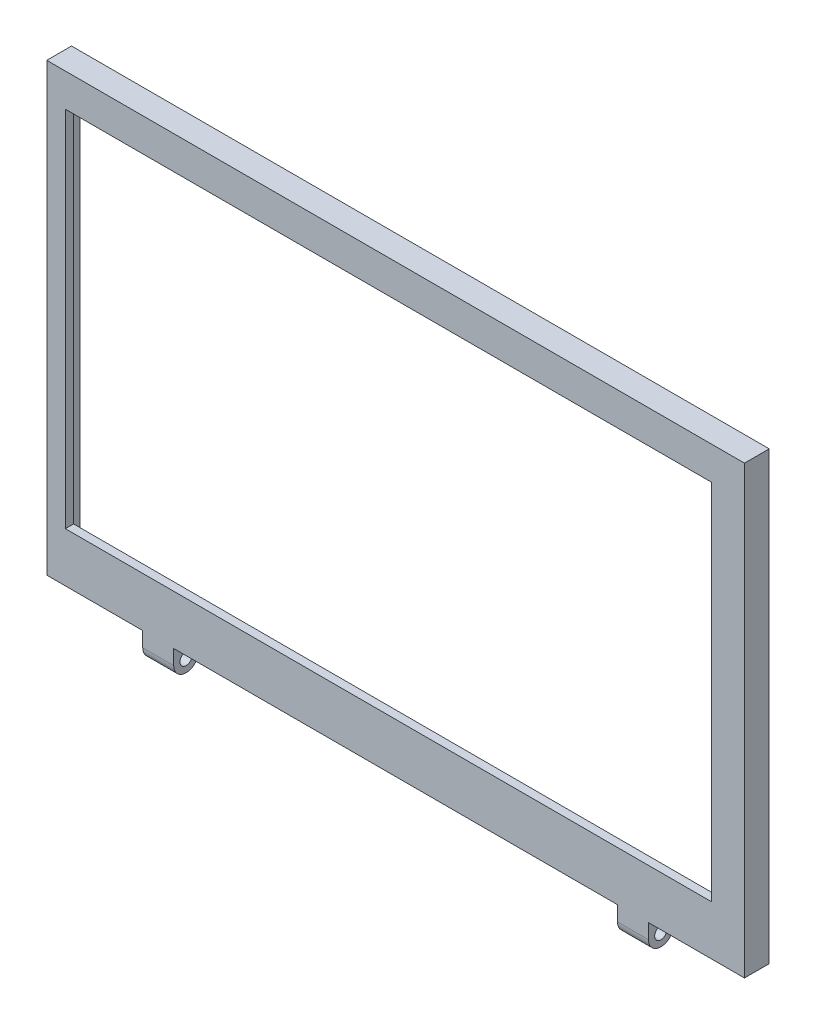
ISO-10303-21;
HEADER;
FILE_DESCRIPTION(('STEP AP214'),'2;1');
FILE_NAME('part.step','',(''),(''),'','','');
FILE_SCHEMA(('AUTOMOTIVE_DESIGN { 1 0 10303 214 1 1 1 1 }'));
ENDSEC;
DATA;
#1=APPLICATION_CONTEXT('core data for automotive mechanical design processes');
#2=APPLICATION_PROTOCOL_DEFINITION('international standard','automotive_design',2000,#1);
#3=PRODUCT_CONTEXT('',#1,'mechanical');
#4=PRODUCT('Part','Part','',(#3));
#5=PRODUCT_RELATED_PRODUCT_CATEGORY('part','',(#4));
#6=PRODUCT_DEFINITION_FORMATION('','',#4);
#7=PRODUCT_DEFINITION_CONTEXT('part definition',#1,'design');
#8=PRODUCT_DEFINITION('design','',#6,#7);
#9=PRODUCT_DEFINITION_SHAPE('','',#8);
#10=(LENGTH_UNIT() NAMED_UNIT(*) SI_UNIT(.MILLI.,.METRE.));
#11=(NAMED_UNIT(*) PLANE_ANGLE_UNIT() SI_UNIT($,.RADIAN.));
#12=(NAMED_UNIT(*) SI_UNIT($,.STERADIAN.) SOLID_ANGLE_UNIT());
#13=UNCERTAINTY_MEASURE_WITH_UNIT(LENGTH_MEASURE(1.E-05),#10,'distance_accuracy_value','');
#14=(GEOMETRIC_REPRESENTATION_CONTEXT(3) GLOBAL_UNCERTAINTY_ASSIGNED_CONTEXT((#13)) GLOBAL_UNIT_ASSIGNED_CONTEXT((#10,
#11,#12)) REPRESENTATION_CONTEXT('',''));
#15=CARTESIAN_POINT('',(0.,0.,0.));
#16=DIRECTION('',(0.,0.,1.));
#17=DIRECTION('',(1.,0.,0.));
#18=AXIS2_PLACEMENT_3D('',#15,#16,#17);
#19=CARTESIAN_POINT('',(53.75,29.,32.));
#20=DIRECTION('',(1.,0.,0.));
#21=DIRECTION('',(0.,0.,1.));
#22=AXIS2_PLACEMENT_3D('',#19,#20,#21);
#23=PLANE('',#22);
#24=DIRECTION('',(0.,-1.,0.));
#25=VECTOR('',#24,1.);
#26=CARTESIAN_POINT('',(53.75,29.,29.));
#27=LINE('',#26,#25);
#28=CARTESIAN_POINT('',(53.75,32.6036869439865,29.));
#29=VERTEX_POINT('',#28);
#30=CARTESIAN_POINT('',(53.75,29.,29.));
#31=VERTEX_POINT('',#30);
#32=EDGE_CURVE('E1127',#29,#31,#27,.T.);
#33=ORIENTED_EDGE('',*,*,#32,.T.);
#34=CARTESIAN_POINT('',(53.75,29.,32.));
#35=DIRECTION('',(-1.,0.,0.));
#36=DIRECTION('',(0.,0.,1.));
#37=AXIS2_PLACEMENT_3D('',#34,#35,#36);
#38=CIRCLE('',#37,3.);
#39=CARTESIAN_POINT('',(53.75,29.,35.));
#40=VERTEX_POINT('',#39);
#41=EDGE_CURVE('E945',#31,#40,#38,.T.);
#42=ORIENTED_EDGE('',*,*,#41,.T.);
#43=DIRECTION('',(0.,1.,0.));
#44=VECTOR('',#43,1.);
#45=CARTESIAN_POINT('',(53.75,29.,35.));
#46=LINE('',#45,#44);
#47=CARTESIAN_POINT('',(53.75,32.6036869439865,35.));
#48=VERTEX_POINT('',#47);
#49=EDGE_CURVE('E1102',#40,#48,#46,.T.);
#50=ORIENTED_EDGE('',*,*,#49,.T.);
#51=DIRECTION('',(0.,0.,-1.));
#52=VECTOR('',#51,1.);
#53=CARTESIAN_POINT('',(53.75,32.6036869439865,29.));
#54=LINE('',#53,#52);
#55=EDGE_CURVE('E1115',#48,#29,#54,.T.);
#56=ORIENTED_EDGE('',*,*,#55,.T.);
#57=EDGE_LOOP('',(#33,#42,#50,#56));
#58=FACE_BOUND('',#57,.T.);
#59=CARTESIAN_POINT('',(53.75,29.,32.));
#60=DIRECTION('',(-1.,0.,0.));
#61=DIRECTION('',(0.,0.,1.));
#62=AXIS2_PLACEMENT_3D('',#59,#60,#61);
#63=CIRCLE('',#62,1.5);
#64=CARTESIAN_POINT('',(53.75,29.,33.5));
#65=VERTEX_POINT('',#64);
#66=EDGE_CURVE('E1151',#65,#65,#63,.T.);
#67=ORIENTED_EDGE('',*,*,#66,.F.);
#68=EDGE_LOOP('',(#67));
#69=FACE_BOUND('',#68,.T.);
#70=ADVANCED_FACE('F941',(#58,#69),#23,.F.);
#71=CARTESIAN_POINT('',(-53.75,29.,32.));
#72=DIRECTION('',(-1.,0.,0.));
#73=DIRECTION('',(0.,0.,1.));
#74=AXIS2_PLACEMENT_3D('',#71,#72,#73);
#75=PLANE('',#74);
#76=DIRECTION('',(0.,-1.,0.));
#77=VECTOR('',#76,1.);
#78=CARTESIAN_POINT('',(-53.75,29.,29.));
#79=LINE('',#78,#77);
#80=CARTESIAN_POINT('',(-53.75,32.6036869439865,29.));
#81=VERTEX_POINT('',#80);
#82=CARTESIAN_POINT('',(-53.75,29.,29.));
#83=VERTEX_POINT('',#82);
#84=EDGE_CURVE('E1140',#81,#83,#79,.T.);
#85=ORIENTED_EDGE('',*,*,#84,.F.);
#86=DIRECTION('',(0.,0.,-1.));
#87=VECTOR('',#86,1.);
#88=CARTESIAN_POINT('',(-53.75,32.6036869439865,29.));
#89=LINE('',#88,#87);
#90=CARTESIAN_POINT('',(-53.75,32.6036869439865,35.));
#91=VERTEX_POINT('',#90);
#92=EDGE_CURVE('E1241',#91,#81,#89,.T.);
#93=ORIENTED_EDGE('',*,*,#92,.F.);
#94=DIRECTION('',(0.,1.,0.));
#95=VECTOR('',#94,1.);
#96=CARTESIAN_POINT('',(-53.75,29.,35.));
#97=LINE('',#96,#95);
#98=CARTESIAN_POINT('',(-53.75,29.,35.));
#99=VERTEX_POINT('',#98);
#100=EDGE_CURVE('E1240',#99,#91,#97,.T.);
#101=ORIENTED_EDGE('',*,*,#100,.F.);
#102=CARTESIAN_POINT('',(-53.75,29.,32.));
#103=DIRECTION('',(-1.,0.,0.));
#104=DIRECTION('',(0.,0.,1.));
#105=AXIS2_PLACEMENT_3D('',#102,#103,#104);
#106=CIRCLE('',#105,3.);
#107=EDGE_CURVE('E1237',#83,#99,#106,.T.);
#108=ORIENTED_EDGE('',*,*,#107,.F.);
#109=EDGE_LOOP('',(#85,#93,#101,#108));
#110=FACE_BOUND('',#109,.T.);
#111=CARTESIAN_POINT('',(-53.75,29.,32.));
#112=DIRECTION('',(-1.,0.,0.));
#113=DIRECTION('',(0.,0.,1.));
#114=AXIS2_PLACEMENT_3D('',#111,#112,#113);
#115=CIRCLE('',#114,1.5);
#116=CARTESIAN_POINT('',(-53.75,29.,33.5));
#117=VERTEX_POINT('',#116);
#118=EDGE_CURVE('E1129',#117,#117,#115,.T.);
#119=ORIENTED_EDGE('',*,*,#118,.T.);
#120=EDGE_LOOP('',(#119));
#121=FACE_BOUND('',#120,.T.);
#122=ADVANCED_FACE('F943',(#110,#121),#75,.F.);
#123=CARTESIAN_POINT('',(0.,0.,33.));
#124=DIRECTION('',(0.,0.,1.));
#125=DIRECTION('',(1.,0.,0.));
#126=AXIS2_PLACEMENT_3D('',#123,#124,#125);
#127=PLANE('',#126);
#128=DIRECTION('',(1.,0.,0.));
#129=VECTOR('',#128,1.);
#130=CARTESIAN_POINT('',(0.,34.6036869439865,33.));
#131=LINE('',#130,#129);
#132=CARTESIAN_POINT('',(-82.5,34.6036869439865,33.));
#133=VERTEX_POINT('',#132);
#134=CARTESIAN_POINT('',(-21.,34.6036869439865,33.));
#135=VERTEX_POINT('',#134);
#136=EDGE_CURVE('E1172',#133,#135,#131,.T.);
#137=ORIENTED_EDGE('',*,*,#136,.F.);
#138=DIRECTION('',(0.,-1.,0.));
#139=VECTOR('',#138,1.);
#140=CARTESIAN_POINT('',(-82.5,36.6036869439865,33.));
#141=LINE('',#140,#139);
#142=CARTESIAN_POINT('',(-82.5,138.603686943987,33.));
#143=VERTEX_POINT('',#142);
#144=EDGE_CURVE('E1335',#143,#133,#141,.T.);
#145=ORIENTED_EDGE('',*,*,#144,.F.);
#146=DIRECTION('',(-1.,0.,0.));
#147=VECTOR('',#146,1.);
#148=CARTESIAN_POINT('',(-82.5,138.603686943987,33.));
#149=LINE('',#148,#147);
#150=CARTESIAN_POINT('',(82.5,138.603686943987,33.));
#151=VERTEX_POINT('',#150);
#152=EDGE_CURVE('E1189',#151,#143,#149,.T.);
#153=ORIENTED_EDGE('',*,*,#152,.F.);
#154=DIRECTION('',(0.,1.,0.));
#155=VECTOR('',#154,1.);
#156=CARTESIAN_POINT('',(82.5,36.6036869439865,33.));
#157=LINE('',#156,#155);
#158=CARTESIAN_POINT('',(82.5,34.6036869439865,33.));
#159=VERTEX_POINT('',#158);
#160=EDGE_CURVE('E1186',#159,#151,#157,.T.);
#161=ORIENTED_EDGE('',*,*,#160,.F.);
#162=CARTESIAN_POINT('',(21.,34.6036869439865,33.));
#163=VERTEX_POINT('',#162);
#164=EDGE_CURVE('E1185',#163,#159,#131,.T.);
#165=ORIENTED_EDGE('',*,*,#164,.F.);
#166=DIRECTION('',(0.,1.,0.));
#167=VECTOR('',#166,1.);
#168=CARTESIAN_POINT('',(21.,29.6036869439865,33.));
#169=LINE('',#168,#167);
#170=CARTESIAN_POINT('',(21.,32.6036869439865,33.));
#171=VERTEX_POINT('',#170);
#172=EDGE_CURVE('E965',#171,#163,#169,.T.);
#173=ORIENTED_EDGE('',*,*,#172,.F.);
#174=DIRECTION('',(1.,0.,0.));
#175=VECTOR('',#174,1.);
#176=CARTESIAN_POINT('',(0.,32.6036869439865,33.));
#177=LINE('',#176,#175);
#178=CARTESIAN_POINT('',(-21.,32.6036869439865,33.));
#179=VERTEX_POINT('',#178);
#180=EDGE_CURVE('E1131',#179,#171,#177,.T.);
#181=ORIENTED_EDGE('',*,*,#180,.F.);
#182=DIRECTION('',(0.,1.,0.));
#183=VECTOR('',#182,1.);
#184=CARTESIAN_POINT('',(-21.,29.6036869439865,33.));
#185=LINE('',#184,#183);
#186=EDGE_CURVE('E1230',#179,#135,#185,.T.);
#187=ORIENTED_EDGE('',*,*,#186,.T.);
#188=EDGE_LOOP('',(#137,#145,#153,#161,#165,#173,#181,#187));
#189=FACE_BOUND('',#188,.T.);
#190=DIRECTION('',(0.,-1.,0.));
#191=VECTOR('',#190,1.);
#192=CARTESIAN_POINT('',(-80.,44.6036869439865,33.));
#193=LINE('',#192,#191);
#194=CARTESIAN_POINT('',(-80.,132.603686943987,33.));
#195=VERTEX_POINT('',#194);
#196=CARTESIAN_POINT('',(-80.,44.6036869439865,33.));
#197=VERTEX_POINT('',#196);
#198=EDGE_CURVE('E1196',#195,#197,#193,.T.);
#199=ORIENTED_EDGE('',*,*,#198,.T.);
#200=DIRECTION('',(1.,0.,0.));
#201=VECTOR('',#200,1.);
#202=CARTESIAN_POINT('',(76.5,44.6036869439865,33.));
#203=LINE('',#202,#201);
#204=CARTESIAN_POINT('',(76.5,44.6036869439865,33.));
#205=VERTEX_POINT('',#204);
#206=EDGE_CURVE('E1206',#197,#205,#203,.T.);
#207=ORIENTED_EDGE('',*,*,#206,.T.);
#208=DIRECTION('',(0.,1.,0.));
#209=VECTOR('',#208,1.);
#210=CARTESIAN_POINT('',(76.5,132.603686943987,33.));
#211=LINE('',#210,#209);
#212=CARTESIAN_POINT('',(76.5,132.603686943987,33.));
#213=VERTEX_POINT('',#212);
#214=EDGE_CURVE('E1220',#205,#213,#211,.T.);
#215=ORIENTED_EDGE('',*,*,#214,.T.);
#216=DIRECTION('',(-1.,0.,0.));
#217=VECTOR('',#216,1.);
#218=CARTESIAN_POINT('',(-80.,132.603686943987,33.));
#219=LINE('',#218,#217);
#220=EDGE_CURVE('E1217',#213,#195,#219,.T.);
#221=ORIENTED_EDGE('',*,*,#220,.T.);
#222=EDGE_LOOP('',(#199,#207,#215,#221));
#223=FACE_BOUND('',#222,.T.);
#224=ADVANCED_FACE('F1366',(#189,#223),#127,.F.);
#225=CARTESIAN_POINT('',(76.5,132.603686943987,33.));
#226=DIRECTION('',(1.,0.,0.));
#227=DIRECTION('',(0.,1.,0.));
#228=AXIS2_PLACEMENT_3D('',#225,#226,#227);
#229=PLANE('',#228);
#230=DIRECTION('',(0.,1.,0.));
#231=VECTOR('',#230,1.);
#232=CARTESIAN_POINT('',(76.5,132.603686943987,35.));
#233=LINE('',#232,#231);
#234=CARTESIAN_POINT('',(76.5,44.6036869439865,35.));
#235=VERTEX_POINT('',#234);
#236=CARTESIAN_POINT('',(76.5,132.603686943987,35.));
#237=VERTEX_POINT('',#236);
#238=EDGE_CURVE('E1209',#235,#237,#233,.T.);
#239=ORIENTED_EDGE('',*,*,#238,.T.);
#240=DIRECTION('',(0.,0.,1.));
#241=VECTOR('',#240,1.);
#242=CARTESIAN_POINT('',(76.5,132.603686943987,33.));
#243=LINE('',#242,#241);
#244=EDGE_CURVE('E1197',#213,#237,#243,.T.);
#245=ORIENTED_EDGE('',*,*,#244,.F.);
#246=ORIENTED_EDGE('',*,*,#214,.F.);
#247=DIRECTION('',(0.,0.,1.));
#248=VECTOR('',#247,1.);
#249=CARTESIAN_POINT('',(76.5,44.6036869439865,33.));
#250=LINE('',#249,#248);
#251=EDGE_CURVE('E1193',#205,#235,#250,.T.);
#252=ORIENTED_EDGE('',*,*,#251,.T.);
#253=EDGE_LOOP('',(#239,#245,#246,#252));
#254=FACE_BOUND('',#253,.T.);
#255=ADVANCED_FACE('F1380',(#254),#229,.F.);
#256=CARTESIAN_POINT('',(-80.,132.603686943987,33.));
#257=DIRECTION('',(0.,1.,0.));
#258=DIRECTION('',(0.,0.,1.));
#259=AXIS2_PLACEMENT_3D('',#256,#257,#258);
#260=PLANE('',#259);
#261=DIRECTION('',(-1.,0.,0.));
#262=VECTOR('',#261,1.);
#263=CARTESIAN_POINT('',(-80.,132.603686943987,35.));
#264=LINE('',#263,#262);
#265=CARTESIAN_POINT('',(-80.,132.603686943987,35.));
#266=VERTEX_POINT('',#265);
#267=EDGE_CURVE('E1205',#237,#266,#264,.T.);
#268=ORIENTED_EDGE('',*,*,#267,.T.);
#269=DIRECTION('',(0.,0.,1.));
#270=VECTOR('',#269,1.);
#271=CARTESIAN_POINT('',(-80.,132.603686943987,33.));
#272=LINE('',#271,#270);
#273=EDGE_CURVE('E1199',#195,#266,#272,.T.);
#274=ORIENTED_EDGE('',*,*,#273,.F.);
#275=ORIENTED_EDGE('',*,*,#220,.F.);
#276=ORIENTED_EDGE('',*,*,#244,.T.);
#277=EDGE_LOOP('',(#268,#274,#275,#276));
#278=FACE_BOUND('',#277,.T.);
#279=ADVANCED_FACE('F1386',(#278),#260,.F.);
#280=CARTESIAN_POINT('',(-80.,44.6036869439865,33.));
#281=DIRECTION('',(-1.,0.,0.));
#282=DIRECTION('',(0.,-1.,0.));
#283=AXIS2_PLACEMENT_3D('',#280,#281,#282);
#284=PLANE('',#283);
#285=DIRECTION('',(0.,-1.,0.));
#286=VECTOR('',#285,1.);
#287=CARTESIAN_POINT('',(-80.,44.6036869439865,35.));
#288=LINE('',#287,#286);
#289=CARTESIAN_POINT('',(-80.,44.6036869439865,35.));
#290=VERTEX_POINT('',#289);
#291=EDGE_CURVE('E1202',#266,#290,#288,.T.);
#292=ORIENTED_EDGE('',*,*,#291,.T.);
#293=DIRECTION('',(0.,0.,1.));
#294=VECTOR('',#293,1.);
#295=CARTESIAN_POINT('',(-80.,44.6036869439865,33.));
#296=LINE('',#295,#294);
#297=EDGE_CURVE('E1192',#197,#290,#296,.T.);
#298=ORIENTED_EDGE('',*,*,#297,.F.);
#299=ORIENTED_EDGE('',*,*,#198,.F.);
#300=ORIENTED_EDGE('',*,*,#273,.T.);
#301=EDGE_LOOP('',(#292,#298,#299,#300));
#302=FACE_BOUND('',#301,.T.);
#303=ADVANCED_FACE('F1396',(#302),#284,.F.);
#304=CARTESIAN_POINT('',(76.5,44.6036869439865,33.));
#305=DIRECTION('',(0.,-1.,0.));
#306=DIRECTION('',(1.,0.,0.));
#307=AXIS2_PLACEMENT_3D('',#304,#305,#306);
#308=PLANE('',#307);
#309=DIRECTION('',(1.,0.,0.));
#310=VECTOR('',#309,1.);
#311=CARTESIAN_POINT('',(76.5,44.6036869439865,35.));
#312=LINE('',#311,#310);
#313=EDGE_CURVE('E1212',#290,#235,#312,.T.);
#314=ORIENTED_EDGE('',*,*,#313,.T.);
#315=ORIENTED_EDGE('',*,*,#251,.F.);
#316=ORIENTED_EDGE('',*,*,#206,.F.);
#317=ORIENTED_EDGE('',*,*,#297,.T.);
#318=EDGE_LOOP('',(#314,#315,#316,#317));
#319=FACE_BOUND('',#318,.T.);
#320=ADVANCED_FACE('F1394',(#319),#308,.F.);
#321=CARTESIAN_POINT('',(61.25,29.,32.));
#322=DIRECTION('',(-1.,0.,0.));
#323=DIRECTION('',(0.,0.,-1.));
#324=AXIS2_PLACEMENT_3D('',#321,#322,#323);
#325=CYLINDRICAL_SURFACE('',#324,3.);
#326=ORIENTED_EDGE('',*,*,#41,.F.);
#327=DIRECTION('',(-1.,0.,0.));
#328=VECTOR('',#327,1.);
#329=CARTESIAN_POINT('',(61.25,29.,29.));
#330=LINE('',#329,#328);
#331=CARTESIAN_POINT('',(61.25,29.,29.));
#332=VERTEX_POINT('',#331);
#333=EDGE_CURVE('E1122',#332,#31,#330,.T.);
#334=ORIENTED_EDGE('',*,*,#333,.F.);
#335=CARTESIAN_POINT('',(61.25,29.,32.));
#336=DIRECTION('',(-1.,0.,0.));
#337=DIRECTION('',(0.,0.,1.));
#338=AXIS2_PLACEMENT_3D('',#335,#336,#337);
#339=CIRCLE('',#338,3.);
#340=CARTESIAN_POINT('',(61.25,29.,35.));
#341=VERTEX_POINT('',#340);
#342=EDGE_CURVE('E1121',#332,#341,#339,.T.);
#343=ORIENTED_EDGE('',*,*,#342,.T.);
#344=DIRECTION('',(-1.,0.,0.));
#345=VECTOR('',#344,1.);
#346=CARTESIAN_POINT('',(61.25,29.,35.));
#347=LINE('',#346,#345);
#348=EDGE_CURVE('E1107',#341,#40,#347,.T.);
#349=ORIENTED_EDGE('',*,*,#348,.T.);
#350=EDGE_LOOP('',(#326,#334,#343,#349));
#351=FACE_BOUND('',#350,.T.);
#352=ADVANCED_FACE('F1119',(#351),#325,.T.);
#353=CARTESIAN_POINT('',(61.25,29.,32.));
#354=DIRECTION('',(1.,0.,0.));
#355=DIRECTION('',(0.,0.,1.));
#356=AXIS2_PLACEMENT_3D('',#353,#354,#355);
#357=PLANE('',#356);
#358=ORIENTED_EDGE('',*,*,#342,.F.);
#359=DIRECTION('',(0.,-1.,0.));
#360=VECTOR('',#359,1.);
#361=CARTESIAN_POINT('',(61.25,29.,29.));
#362=LINE('',#361,#360);
#363=CARTESIAN_POINT('',(61.25,32.6036869439865,29.));
#364=VERTEX_POINT('',#363);
#365=EDGE_CURVE('E1293',#364,#332,#362,.T.);
#366=ORIENTED_EDGE('',*,*,#365,.F.);
#367=DIRECTION('',(0.,0.,-1.));
#368=VECTOR('',#367,1.);
#369=CARTESIAN_POINT('',(61.25,32.6036869439865,29.));
#370=LINE('',#369,#368);
#371=CARTESIAN_POINT('',(61.25,32.6036869439865,35.));
#372=VERTEX_POINT('',#371);
#373=EDGE_CURVE('E1145',#372,#364,#370,.T.);
#374=ORIENTED_EDGE('',*,*,#373,.F.);
#375=DIRECTION('',(0.,1.,0.));
#376=VECTOR('',#375,1.);
#377=CARTESIAN_POINT('',(61.25,29.,35.));
#378=LINE('',#377,#376);
#379=EDGE_CURVE('E1143',#341,#372,#378,.T.);
#380=ORIENTED_EDGE('',*,*,#379,.F.);
#381=EDGE_LOOP('',(#358,#366,#374,#380));
#382=FACE_BOUND('',#381,.T.);
#383=CARTESIAN_POINT('',(61.25,29.,32.));
#384=DIRECTION('',(-1.,0.,0.));
#385=DIRECTION('',(0.,0.,1.));
#386=AXIS2_PLACEMENT_3D('',#383,#384,#385);
#387=CIRCLE('',#386,1.5);
#388=CARTESIAN_POINT('',(61.25,29.,33.5));
#389=VERTEX_POINT('',#388);
#390=EDGE_CURVE('E1114',#389,#389,#387,.T.);
#391=ORIENTED_EDGE('',*,*,#390,.T.);
#392=EDGE_LOOP('',(#391));
#393=FACE_BOUND('',#392,.T.);
#394=ADVANCED_FACE('F1304',(#382,#393),#357,.T.);
#395=CARTESIAN_POINT('',(0.,32.6036869439865,0.));
#396=DIRECTION('',(0.,1.,0.));
#397=DIRECTION('',(0.,0.,1.));
#398=AXIS2_PLACEMENT_3D('',#395,#396,#397);
#399=PLANE('',#398);
#400=ORIENTED_EDGE('',*,*,#373,.T.);
#401=DIRECTION('',(-1.,0.,0.));
#402=VECTOR('',#401,1.);
#403=CARTESIAN_POINT('',(-84.5,32.6036869439865,29.));
#404=LINE('',#403,#402);
#405=CARTESIAN_POINT('',(84.5,32.6036869439865,29.));
#406=VERTEX_POINT('',#405);
#407=EDGE_CURVE('E1277',#406,#364,#404,.T.);
#408=ORIENTED_EDGE('',*,*,#407,.F.);
#409=DIRECTION('',(0.,0.,-1.));
#410=VECTOR('',#409,1.);
#411=CARTESIAN_POINT('',(84.5,32.6036869439865,29.));
#412=LINE('',#411,#410);
#413=CARTESIAN_POINT('',(84.5,32.6036869439865,35.));
#414=VERTEX_POINT('',#413);
#415=EDGE_CURVE('E1284',#414,#406,#412,.T.);
#416=ORIENTED_EDGE('',*,*,#415,.F.);
#417=DIRECTION('',(1.,0.,0.));
#418=VECTOR('',#417,1.);
#419=CARTESIAN_POINT('',(-84.5,32.6036869439865,35.));
#420=LINE('',#419,#418);
#421=EDGE_CURVE('E1289',#372,#414,#420,.T.);
#422=ORIENTED_EDGE('',*,*,#421,.F.);
#423=EDGE_LOOP('',(#400,#408,#416,#422));
#424=FACE_BOUND('',#423,.T.);
#425=ADVANCED_FACE('F1301',(#424),#399,.F.);
#426=CARTESIAN_POINT('',(84.5,34.6036869439865,29.));
#427=DIRECTION('',(-1.,0.,0.));
#428=DIRECTION('',(0.,0.,1.));
#429=AXIS2_PLACEMENT_3D('',#426,#427,#428);
#430=PLANE('',#429);
#431=ORIENTED_EDGE('',*,*,#415,.T.);
#432=DIRECTION('',(0.,-1.,0.));
#433=VECTOR('',#432,1.);
#434=CARTESIAN_POINT('',(84.5,34.6036869439865,29.));
#435=LINE('',#434,#433);
#436=CARTESIAN_POINT('',(84.5,140.603686943987,29.));
#437=VERTEX_POINT('',#436);
#438=EDGE_CURVE('E1270',#437,#406,#435,.T.);
#439=ORIENTED_EDGE('',*,*,#438,.F.);
#440=DIRECTION('',(0.,0.,1.));
#441=VECTOR('',#440,1.);
#442=CARTESIAN_POINT('',(84.5,140.603686943987,29.));
#443=LINE('',#442,#441);
#444=CARTESIAN_POINT('',(84.5,140.603686943987,35.));
#445=VERTEX_POINT('',#444);
#446=EDGE_CURVE('E1165',#437,#445,#443,.T.);
#447=ORIENTED_EDGE('',*,*,#446,.T.);
#448=DIRECTION('',(0.,-1.,0.));
#449=VECTOR('',#448,1.);
#450=CARTESIAN_POINT('',(84.5,34.6036869439865,35.));
#451=LINE('',#450,#449);
#452=EDGE_CURVE('E1267',#445,#414,#451,.T.);
#453=ORIENTED_EDGE('',*,*,#452,.T.);
#454=EDGE_LOOP('',(#431,#439,#447,#453));
#455=FACE_BOUND('',#454,.T.);
#456=ADVANCED_FACE('F1312',(#455),#430,.F.);
#457=CARTESIAN_POINT('',(-84.5,140.603686943987,29.));
#458=DIRECTION('',(0.,1.,0.));
#459=DIRECTION('',(0.,0.,1.));
#460=AXIS2_PLACEMENT_3D('',#457,#458,#459);
#461=PLANE('',#460);
#462=DIRECTION('',(-1.,0.,0.));
#463=VECTOR('',#462,1.);
#464=CARTESIAN_POINT('',(-84.5,140.603686943987,35.));
#465=LINE('',#464,#463);
#466=CARTESIAN_POINT('',(-84.5,140.603686943987,35.));
#467=VERTEX_POINT('',#466);
#468=EDGE_CURVE('E1169',#445,#467,#465,.T.);
#469=ORIENTED_EDGE('',*,*,#468,.F.);
#470=ORIENTED_EDGE('',*,*,#446,.F.);
#471=DIRECTION('',(-1.,0.,0.));
#472=VECTOR('',#471,1.);
#473=CARTESIAN_POINT('',(-84.5,140.603686943987,29.));
#474=LINE('',#473,#472);
#475=CARTESIAN_POINT('',(-84.5,140.603686943987,29.));
#476=VERTEX_POINT('',#475);
#477=EDGE_CURVE('E1155',#437,#476,#474,.T.);
#478=ORIENTED_EDGE('',*,*,#477,.T.);
#479=DIRECTION('',(0.,0.,1.));
#480=VECTOR('',#479,1.);
#481=CARTESIAN_POINT('',(-84.5,140.603686943987,29.));
#482=LINE('',#481,#480);
#483=EDGE_CURVE('E1167',#476,#467,#482,.T.);
#484=ORIENTED_EDGE('',*,*,#483,.T.);
#485=EDGE_LOOP('',(#469,#470,#478,#484));
#486=FACE_BOUND('',#485,.T.);
#487=ADVANCED_FACE('F1316',(#486),#461,.T.);
#488=CARTESIAN_POINT('',(-84.5,34.6036869439865,29.));
#489=DIRECTION('',(1.,0.,0.));
#490=DIRECTION('',(0.,0.,-1.));
#491=AXIS2_PLACEMENT_3D('',#488,#489,#490);
#492=PLANE('',#491);
#493=DIRECTION('',(0.,-1.,0.));
#494=VECTOR('',#493,1.);
#495=CARTESIAN_POINT('',(-84.5,34.6036869439865,35.));
#496=LINE('',#495,#494);
#497=CARTESIAN_POINT('',(-84.5,32.6036869439865,35.));
#498=VERTEX_POINT('',#497);
#499=EDGE_CURVE('E1264',#467,#498,#496,.T.);
#500=ORIENTED_EDGE('',*,*,#499,.F.);
#501=ORIENTED_EDGE('',*,*,#483,.F.);
#502=DIRECTION('',(0.,-1.,0.));
#503=VECTOR('',#502,1.);
#504=CARTESIAN_POINT('',(-84.5,34.6036869439865,29.));
#505=LINE('',#504,#503);
#506=CARTESIAN_POINT('',(-84.5,32.6036869439865,29.));
#507=VERTEX_POINT('',#506);
#508=EDGE_CURVE('E1273',#476,#507,#505,.T.);
#509=ORIENTED_EDGE('',*,*,#508,.T.);
#510=DIRECTION('',(0.,0.,1.));
#511=VECTOR('',#510,1.);
#512=CARTESIAN_POINT('',(-84.5,32.6036869439865,29.));
#513=LINE('',#512,#511);
#514=EDGE_CURVE('E1123',#507,#498,#513,.T.);
#515=ORIENTED_EDGE('',*,*,#514,.T.);
#516=EDGE_LOOP('',(#500,#501,#509,#515));
#517=FACE_BOUND('',#516,.T.);
#518=ADVANCED_FACE('F1321',(#517),#492,.F.);
#519=CARTESIAN_POINT('',(-61.25,32.6036869439865,35.));
#520=VERTEX_POINT('',#519);
#521=EDGE_CURVE('E1286',#498,#520,#420,.T.);
#522=ORIENTED_EDGE('',*,*,#521,.F.);
#523=ORIENTED_EDGE('',*,*,#514,.F.);
#524=CARTESIAN_POINT('',(-61.25,32.6036869439865,29.));
#525=VERTEX_POINT('',#524);
#526=EDGE_CURVE('E1283',#525,#507,#404,.T.);
#527=ORIENTED_EDGE('',*,*,#526,.F.);
#528=DIRECTION('',(0.,0.,-1.));
#529=VECTOR('',#528,1.);
#530=CARTESIAN_POINT('',(-61.25,32.6036869439865,29.));
#531=LINE('',#530,#529);
#532=EDGE_CURVE('E1255',#520,#525,#531,.T.);
#533=ORIENTED_EDGE('',*,*,#532,.F.);
#534=EDGE_LOOP('',(#522,#523,#527,#533));
#535=FACE_BOUND('',#534,.T.);
#536=ADVANCED_FACE('F1325',(#535),#399,.F.);
#537=CARTESIAN_POINT('',(-61.25,29.,32.));
#538=DIRECTION('',(-1.,0.,0.));
#539=DIRECTION('',(0.,0.,1.));
#540=AXIS2_PLACEMENT_3D('',#537,#538,#539);
#541=PLANE('',#540);
#542=CARTESIAN_POINT('',(-61.25,29.,32.));
#543=DIRECTION('',(-1.,0.,0.));
#544=DIRECTION('',(0.,0.,1.));
#545=AXIS2_PLACEMENT_3D('',#542,#543,#544);
#546=CIRCLE('',#545,3.);
#547=CARTESIAN_POINT('',(-61.25,29.,29.));
#548=VERTEX_POINT('',#547);
#549=CARTESIAN_POINT('',(-61.25,29.,35.));
#550=VERTEX_POINT('',#549);
#551=EDGE_CURVE('E1248',#548,#550,#546,.T.);
#552=ORIENTED_EDGE('',*,*,#551,.T.);
#553=DIRECTION('',(0.,1.,0.));
#554=VECTOR('',#553,1.);
#555=CARTESIAN_POINT('',(-61.25,29.,35.));
#556=LINE('',#555,#554);
#557=EDGE_CURVE('E1257',#550,#520,#556,.T.);
#558=ORIENTED_EDGE('',*,*,#557,.T.);
#559=ORIENTED_EDGE('',*,*,#532,.T.);
#560=DIRECTION('',(0.,-1.,0.));
#561=VECTOR('',#560,1.);
#562=CARTESIAN_POINT('',(-61.25,29.,29.));
#563=LINE('',#562,#561);
#564=EDGE_CURVE('E1253',#525,#548,#563,.T.);
#565=ORIENTED_EDGE('',*,*,#564,.T.);
#566=EDGE_LOOP('',(#552,#558,#559,#565));
#567=FACE_BOUND('',#566,.T.);
#568=CARTESIAN_POINT('',(-61.25,29.,32.));
#569=DIRECTION('',(-1.,0.,0.));
#570=DIRECTION('',(0.,0.,1.));
#571=AXIS2_PLACEMENT_3D('',#568,#569,#570);
#572=CIRCLE('',#571,1.5);
#573=CARTESIAN_POINT('',(-61.25,29.,33.5));
#574=VERTEX_POINT('',#573);
#575=EDGE_CURVE('E1239',#574,#574,#572,.T.);
#576=ORIENTED_EDGE('',*,*,#575,.F.);
#577=EDGE_LOOP('',(#576));
#578=FACE_BOUND('',#577,.T.);
#579=ADVANCED_FACE('F1328',(#567,#578),#541,.T.);
#580=CARTESIAN_POINT('',(-61.25,29.,32.));
#581=DIRECTION('',(1.,0.,0.));
#582=DIRECTION('',(0.,0.,-1.));
#583=AXIS2_PLACEMENT_3D('',#580,#581,#582);
#584=CYLINDRICAL_SURFACE('',#583,3.);
#585=ORIENTED_EDGE('',*,*,#107,.T.);
#586=DIRECTION('',(1.,0.,0.));
#587=VECTOR('',#586,1.);
#588=CARTESIAN_POINT('',(-61.25,29.,35.));
#589=LINE('',#588,#587);
#590=EDGE_CURVE('E1333',#550,#99,#589,.T.);
#591=ORIENTED_EDGE('',*,*,#590,.F.);
#592=ORIENTED_EDGE('',*,*,#551,.F.);
#593=DIRECTION('',(1.,0.,0.));
#594=VECTOR('',#593,1.);
#595=CARTESIAN_POINT('',(-61.25,29.,29.));
#596=LINE('',#595,#594);
#597=EDGE_CURVE('E1251',#548,#83,#596,.T.);
#598=ORIENTED_EDGE('',*,*,#597,.T.);
#599=EDGE_LOOP('',(#585,#591,#592,#598));
#600=FACE_BOUND('',#599,.T.);
#601=ADVANCED_FACE('F1369',(#600),#584,.T.);
#602=CARTESIAN_POINT('',(-21.,29.6036869439865,29.));
#603=DIRECTION('',(-1.,0.,0.));
#604=DIRECTION('',(0.,0.,1.));
#605=AXIS2_PLACEMENT_3D('',#602,#603,#604);
#606=PLANE('',#605);
#607=DIRECTION('',(0.,-1.,0.));
#608=VECTOR('',#607,1.);
#609=CARTESIAN_POINT('',(-21.,29.,29.));
#610=LINE('',#609,#608);
#611=CARTESIAN_POINT('',(-21.,34.6036869439865,29.));
#612=VERTEX_POINT('',#611);
#613=CARTESIAN_POINT('',(-21.,32.6036869439865,29.));
#614=VERTEX_POINT('',#613);
#615=EDGE_CURVE('E957',#612,#614,#610,.T.);
#616=ORIENTED_EDGE('',*,*,#615,.F.);
#617=DIRECTION('',(0.,0.,1.));
#618=VECTOR('',#617,1.);
#619=CARTESIAN_POINT('',(-21.,34.6036869439865,29.));
#620=LINE('',#619,#618);
#621=EDGE_CURVE('E12',#612,#135,#620,.T.);
#622=ORIENTED_EDGE('',*,*,#621,.T.);
#623=ORIENTED_EDGE('',*,*,#186,.F.);
#624=DIRECTION('',(0.,0.,1.));
#625=VECTOR('',#624,1.);
#626=CARTESIAN_POINT('',(-21.,32.6036869439865,0.));
#627=LINE('',#626,#625);
#628=EDGE_CURVE('E1227',#614,#179,#627,.T.);
#629=ORIENTED_EDGE('',*,*,#628,.F.);
#630=EDGE_LOOP('',(#616,#622,#623,#629));
#631=FACE_BOUND('',#630,.T.);
#632=ADVANCED_FACE('F1364',(#631),#606,.F.);
#633=CARTESIAN_POINT('',(0.,34.6036869439865,0.));
#634=DIRECTION('',(0.,1.,0.));
#635=DIRECTION('',(0.,0.,1.));
#636=AXIS2_PLACEMENT_3D('',#633,#634,#635);
#637=PLANE('',#636);
#638=ORIENTED_EDGE('',*,*,#621,.F.);
#639=DIRECTION('',(-1.,0.,0.));
#640=VECTOR('',#639,1.);
#641=CARTESIAN_POINT('',(-84.5,34.6036869439865,29.));
#642=LINE('',#641,#640);
#643=CARTESIAN_POINT('',(-82.5,34.6036869439865,29.));
#644=VERTEX_POINT('',#643);
#645=EDGE_CURVE('E1281',#612,#644,#642,.T.);
#646=ORIENTED_EDGE('',*,*,#645,.T.);
#647=DIRECTION('',(0.,0.,1.));
#648=VECTOR('',#647,1.);
#649=CARTESIAN_POINT('',(-82.5,34.6036869439865,29.));
#650=LINE('',#649,#648);
#651=EDGE_CURVE('E1152',#644,#133,#650,.T.);
#652=ORIENTED_EDGE('',*,*,#651,.T.);
#653=ORIENTED_EDGE('',*,*,#136,.T.);
#654=EDGE_LOOP('',(#638,#646,#652,#653));
#655=FACE_BOUND('',#654,.T.);
#656=ADVANCED_FACE('F1362',(#655),#637,.T.);
#657=CARTESIAN_POINT('',(-82.5,36.6036869439865,29.));
#658=DIRECTION('',(1.,0.,0.));
#659=DIRECTION('',(0.,0.,-1.));
#660=AXIS2_PLACEMENT_3D('',#657,#658,#659);
#661=PLANE('',#660);
#662=DIRECTION('',(0.,0.,1.));
#663=VECTOR('',#662,1.);
#664=CARTESIAN_POINT('',(-82.5,138.603686943987,29.));
#665=LINE('',#664,#663);
#666=CARTESIAN_POINT('',(-82.5,138.603686943987,29.));
#667=VERTEX_POINT('',#666);
#668=EDGE_CURVE('E1156',#667,#143,#665,.T.);
#669=ORIENTED_EDGE('',*,*,#668,.T.);
#670=ORIENTED_EDGE('',*,*,#144,.T.);
#671=ORIENTED_EDGE('',*,*,#651,.F.);
#672=DIRECTION('',(0.,1.,0.));
#673=VECTOR('',#672,1.);
#674=CARTESIAN_POINT('',(-82.5,36.6036869439865,29.));
#675=LINE('',#674,#673);
#676=EDGE_CURVE('E1173',#644,#667,#675,.T.);
#677=ORIENTED_EDGE('',*,*,#676,.T.);
#678=EDGE_LOOP('',(#669,#670,#671,#677));
#679=FACE_BOUND('',#678,.T.);
#680=ADVANCED_FACE('F1357',(#679),#661,.T.);
#681=CARTESIAN_POINT('',(-82.5,138.603686943987,29.));
#682=DIRECTION('',(0.,-1.,0.));
#683=DIRECTION('',(0.,0.,-1.));
#684=AXIS2_PLACEMENT_3D('',#681,#682,#683);
#685=PLANE('',#684);
#686=DIRECTION('',(0.,0.,1.));
#687=VECTOR('',#686,1.);
#688=CARTESIAN_POINT('',(82.5,138.603686943987,29.));
#689=LINE('',#688,#687);
#690=CARTESIAN_POINT('',(82.5,138.603686943987,29.));
#691=VERTEX_POINT('',#690);
#692=EDGE_CURVE('E1159',#691,#151,#689,.T.);
#693=ORIENTED_EDGE('',*,*,#692,.T.);
#694=ORIENTED_EDGE('',*,*,#152,.T.);
#695=ORIENTED_EDGE('',*,*,#668,.F.);
#696=DIRECTION('',(1.,0.,0.));
#697=VECTOR('',#696,1.);
#698=CARTESIAN_POINT('',(-82.5,138.603686943987,29.));
#699=LINE('',#698,#697);
#700=EDGE_CURVE('E1179',#667,#691,#699,.T.);
#701=ORIENTED_EDGE('',*,*,#700,.T.);
#702=EDGE_LOOP('',(#693,#694,#695,#701));
#703=FACE_BOUND('',#702,.T.);
#704=ADVANCED_FACE('F1355',(#703),#685,.T.);
#705=CARTESIAN_POINT('',(82.5,36.6036869439865,29.));
#706=DIRECTION('',(-1.,0.,0.));
#707=DIRECTION('',(0.,0.,1.));
#708=AXIS2_PLACEMENT_3D('',#705,#706,#707);
#709=PLANE('',#708);
#710=DIRECTION('',(0.,0.,1.));
#711=VECTOR('',#710,1.);
#712=CARTESIAN_POINT('',(82.5,34.6036869439865,29.));
#713=LINE('',#712,#711);
#714=CARTESIAN_POINT('',(82.5,34.6036869439865,29.));
#715=VERTEX_POINT('',#714);
#716=EDGE_CURVE('E1162',#715,#159,#713,.T.);
#717=ORIENTED_EDGE('',*,*,#716,.T.);
#718=ORIENTED_EDGE('',*,*,#160,.T.);
#719=ORIENTED_EDGE('',*,*,#692,.F.);
#720=DIRECTION('',(0.,-1.,0.));
#721=VECTOR('',#720,1.);
#722=CARTESIAN_POINT('',(82.5,36.6036869439865,29.));
#723=LINE('',#722,#721);
#724=EDGE_CURVE('E1176',#691,#715,#723,.T.);
#725=ORIENTED_EDGE('',*,*,#724,.T.);
#726=EDGE_LOOP('',(#717,#718,#719,#725));
#727=FACE_BOUND('',#726,.T.);
#728=ADVANCED_FACE('F1350',(#727),#709,.T.);
#729=DIRECTION('',(0.,0.,-1.));
#730=VECTOR('',#729,1.);
#731=CARTESIAN_POINT('',(21.,34.6036869439865,33.));
#732=LINE('',#731,#730);
#733=CARTESIAN_POINT('',(21.,34.6036869439865,29.));
#734=VERTEX_POINT('',#733);
#735=EDGE_CURVE('E950',#163,#734,#732,.T.);
#736=ORIENTED_EDGE('',*,*,#735,.F.);
#737=ORIENTED_EDGE('',*,*,#164,.T.);
#738=ORIENTED_EDGE('',*,*,#716,.F.);
#739=EDGE_CURVE('E1276',#715,#734,#642,.T.);
#740=ORIENTED_EDGE('',*,*,#739,.T.);
#741=EDGE_LOOP('',(#736,#737,#738,#740));
#742=FACE_BOUND('',#741,.T.);
#743=ADVANCED_FACE('F1346',(#742),#637,.T.);
#744=CARTESIAN_POINT('',(21.,29.6036869439865,33.));
#745=DIRECTION('',(1.,0.,0.));
#746=DIRECTION('',(0.,0.,-1.));
#747=AXIS2_PLACEMENT_3D('',#744,#745,#746);
#748=PLANE('',#747);
#749=ORIENTED_EDGE('',*,*,#172,.T.);
#750=ORIENTED_EDGE('',*,*,#735,.T.);
#751=DIRECTION('',(0.,1.,0.));
#752=VECTOR('',#751,1.);
#753=CARTESIAN_POINT('',(21.,29.,29.));
#754=LINE('',#753,#752);
#755=CARTESIAN_POINT('',(21.,32.6036869439865,29.));
#756=VERTEX_POINT('',#755);
#757=EDGE_CURVE('E1136',#756,#734,#754,.T.);
#758=ORIENTED_EDGE('',*,*,#757,.F.);
#759=DIRECTION('',(0.,0.,-1.));
#760=VECTOR('',#759,1.);
#761=CARTESIAN_POINT('',(21.,32.6036869439865,0.));
#762=LINE('',#761,#760);
#763=EDGE_CURVE('E1214',#171,#756,#762,.T.);
#764=ORIENTED_EDGE('',*,*,#763,.F.);
#765=EDGE_LOOP('',(#749,#750,#758,#764));
#766=FACE_BOUND('',#765,.T.);
#767=ADVANCED_FACE('F1405',(#766),#748,.F.);
#768=ORIENTED_EDGE('',*,*,#180,.T.);
#769=ORIENTED_EDGE('',*,*,#763,.T.);
#770=EDGE_CURVE('E1280',#29,#756,#404,.T.);
#771=ORIENTED_EDGE('',*,*,#770,.F.);
#772=ORIENTED_EDGE('',*,*,#55,.F.);
#773=EDGE_CURVE('E1110',#91,#48,#420,.T.);
#774=ORIENTED_EDGE('',*,*,#773,.F.);
#775=ORIENTED_EDGE('',*,*,#92,.T.);
#776=EDGE_CURVE('E1282',#614,#81,#404,.T.);
#777=ORIENTED_EDGE('',*,*,#776,.F.);
#778=ORIENTED_EDGE('',*,*,#628,.T.);
#779=EDGE_LOOP('',(#768,#769,#771,#772,#774,#775,#777,#778));
#780=FACE_BOUND('',#779,.T.);
#781=ADVANCED_FACE('F1368',(#780),#399,.F.);
#782=CARTESIAN_POINT('',(-61.25,29.,29.));
#783=DIRECTION('',(0.,0.,1.));
#784=DIRECTION('',(1.,0.,0.));
#785=AXIS2_PLACEMENT_3D('',#782,#783,#784);
#786=PLANE('',#785);
#787=ORIENTED_EDGE('',*,*,#770,.T.);
#788=ORIENTED_EDGE('',*,*,#757,.T.);
#789=ORIENTED_EDGE('',*,*,#739,.F.);
#790=ORIENTED_EDGE('',*,*,#724,.F.);
#791=ORIENTED_EDGE('',*,*,#700,.F.);
#792=ORIENTED_EDGE('',*,*,#676,.F.);
#793=ORIENTED_EDGE('',*,*,#645,.F.);
#794=ORIENTED_EDGE('',*,*,#615,.T.);
#795=ORIENTED_EDGE('',*,*,#776,.T.);
#796=ORIENTED_EDGE('',*,*,#84,.T.);
#797=ORIENTED_EDGE('',*,*,#597,.F.);
#798=ORIENTED_EDGE('',*,*,#564,.F.);
#799=ORIENTED_EDGE('',*,*,#526,.T.);
#800=ORIENTED_EDGE('',*,*,#508,.F.);
#801=ORIENTED_EDGE('',*,*,#477,.F.);
#802=ORIENTED_EDGE('',*,*,#438,.T.);
#803=ORIENTED_EDGE('',*,*,#407,.T.);
#804=ORIENTED_EDGE('',*,*,#365,.T.);
#805=ORIENTED_EDGE('',*,*,#333,.T.);
#806=ORIENTED_EDGE('',*,*,#32,.F.);
#807=EDGE_LOOP('',(#787,#788,#789,#790,#791,#792,#793,#794,#795,#796,#797,#798,#799,#800,#801,
#802,#803,#804,#805,#806));
#808=FACE_BOUND('',#807,.T.);
#809=ADVANCED_FACE('F1308',(#808),#786,.F.);
#810=CARTESIAN_POINT('',(-61.25,29.,35.));
#811=DIRECTION('',(0.,0.,-1.));
#812=DIRECTION('',(-1.,0.,0.));
#813=AXIS2_PLACEMENT_3D('',#810,#811,#812);
#814=PLANE('',#813);
#815=ORIENTED_EDGE('',*,*,#590,.T.);
#816=ORIENTED_EDGE('',*,*,#100,.T.);
#817=ORIENTED_EDGE('',*,*,#773,.T.);
#818=ORIENTED_EDGE('',*,*,#49,.F.);
#819=ORIENTED_EDGE('',*,*,#348,.F.);
#820=ORIENTED_EDGE('',*,*,#379,.T.);
#821=ORIENTED_EDGE('',*,*,#421,.T.);
#822=ORIENTED_EDGE('',*,*,#452,.F.);
#823=ORIENTED_EDGE('',*,*,#468,.T.);
#824=ORIENTED_EDGE('',*,*,#499,.T.);
#825=ORIENTED_EDGE('',*,*,#521,.T.);
#826=ORIENTED_EDGE('',*,*,#557,.F.);
#827=EDGE_LOOP('',(#815,#816,#817,#818,#819,#820,#821,#822,#823,#824,#825,#826));
#828=FACE_BOUND('',#827,.T.);
#829=ORIENTED_EDGE('',*,*,#313,.F.);
#830=ORIENTED_EDGE('',*,*,#291,.F.);
#831=ORIENTED_EDGE('',*,*,#267,.F.);
#832=ORIENTED_EDGE('',*,*,#238,.F.);
#833=EDGE_LOOP('',(#829,#830,#831,#832));
#834=FACE_BOUND('',#833,.T.);
#835=ADVANCED_FACE('F1105',(#828,#834),#814,.F.);
#836=CARTESIAN_POINT('',(61.25,29.,32.));
#837=DIRECTION('',(-1.,0.,0.));
#838=DIRECTION('',(0.,0.,-1.));
#839=AXIS2_PLACEMENT_3D('',#836,#837,#838);
#840=CYLINDRICAL_SURFACE('',#839,1.5);
#841=ORIENTED_EDGE('',*,*,#390,.F.);
#842=EDGE_LOOP('',(#841));
#843=FACE_BOUND('',#842,.T.);
#844=ORIENTED_EDGE('',*,*,#66,.T.);
#845=EDGE_LOOP('',(#844));
#846=FACE_BOUND('',#845,.T.);
#847=ADVANCED_FACE('F1586',(#843,#846),#840,.F.);
#848=CARTESIAN_POINT('',(-61.25,29.,32.));
#849=DIRECTION('',(1.,0.,0.));
#850=DIRECTION('',(0.,0.,-1.));
#851=AXIS2_PLACEMENT_3D('',#848,#849,#850);
#852=CYLINDRICAL_SURFACE('',#851,1.5);
#853=ORIENTED_EDGE('',*,*,#575,.T.);
#854=EDGE_LOOP('',(#853));
#855=FACE_BOUND('',#854,.T.);
#856=ORIENTED_EDGE('',*,*,#118,.F.);
#857=EDGE_LOOP('',(#856));
#858=FACE_BOUND('',#857,.T.);
#859=ADVANCED_FACE('F1390',(#855,#858),#852,.F.);
#860=CLOSED_SHELL('',(#70,#122,#224,#255,#279,#303,#320,#352,#394,#425,#456,#487,#518,#536,#579,
#601,#632,#656,#680,#704,#728,#743,#767,#781,#809,#835,#847,#859));
#861=MANIFOLD_SOLID_BREP('B2',#860);
#862=ADVANCED_BREP_SHAPE_REPRESENTATION('',(#18,#861),#14);
#863=SHAPE_DEFINITION_REPRESENTATION(#9,#862);
ENDSEC;
END-ISO-10303-21;
